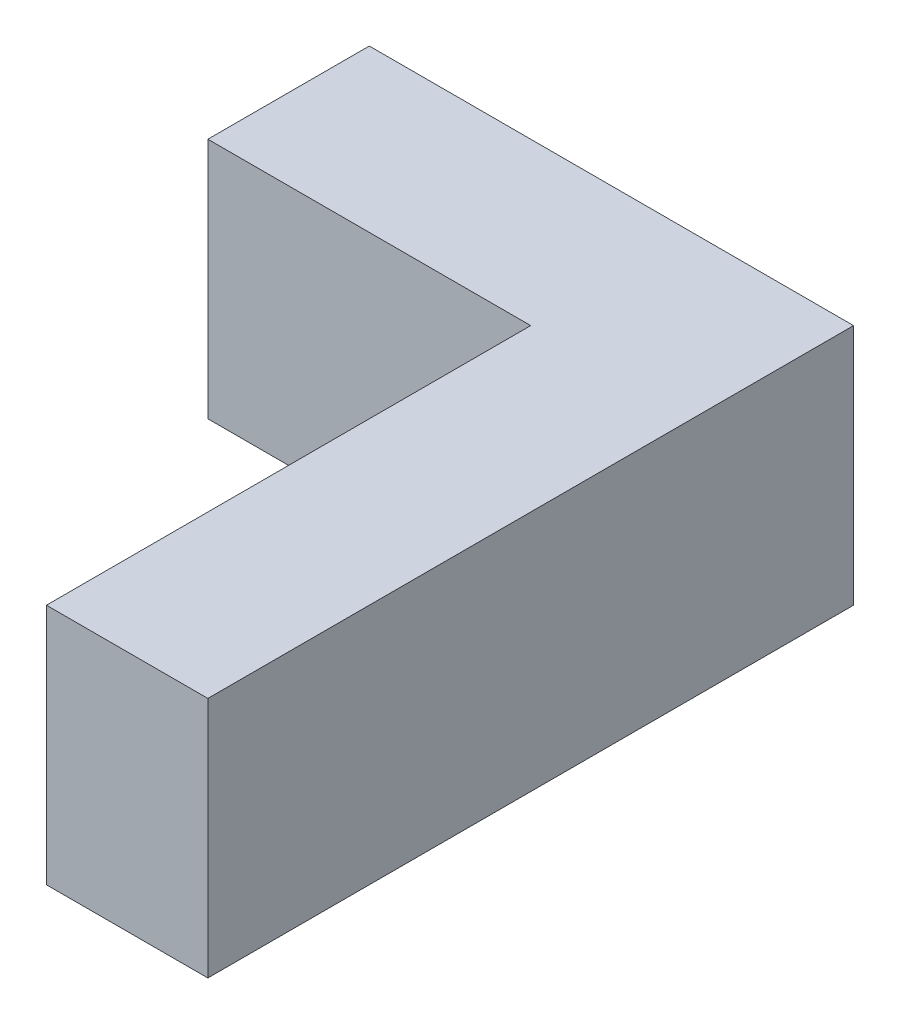
ISO-10303-21;
HEADER;
FILE_DESCRIPTION(('STEP AP214'),'2;1');
FILE_NAME('part.step','',(''),(''),'','','');
FILE_SCHEMA(('AUTOMOTIVE_DESIGN { 1 0 10303 214 1 1 1 1 }'));
ENDSEC;
DATA;
#1=APPLICATION_CONTEXT('core data for automotive mechanical design processes');
#2=APPLICATION_PROTOCOL_DEFINITION('international standard','automotive_design',2000,#1);
#3=PRODUCT_CONTEXT('',#1,'mechanical');
#4=PRODUCT('Part','Part','',(#3));
#5=PRODUCT_RELATED_PRODUCT_CATEGORY('part','',(#4));
#6=PRODUCT_DEFINITION_FORMATION('','',#4);
#7=PRODUCT_DEFINITION_CONTEXT('part definition',#1,'design');
#8=PRODUCT_DEFINITION('design','',#6,#7);
#9=PRODUCT_DEFINITION_SHAPE('','',#8);
#10=(LENGTH_UNIT() NAMED_UNIT(*) SI_UNIT(.MILLI.,.METRE.));
#11=(NAMED_UNIT(*) PLANE_ANGLE_UNIT() SI_UNIT($,.RADIAN.));
#12=(NAMED_UNIT(*) SI_UNIT($,.STERADIAN.) SOLID_ANGLE_UNIT());
#13=UNCERTAINTY_MEASURE_WITH_UNIT(LENGTH_MEASURE(1.E-05),#10,'distance_accuracy_value','');
#14=(GEOMETRIC_REPRESENTATION_CONTEXT(3) GLOBAL_UNCERTAINTY_ASSIGNED_CONTEXT((#13)) GLOBAL_UNIT_ASSIGNED_CONTEXT((#10,
#11,#12)) REPRESENTATION_CONTEXT('',''));
#15=CARTESIAN_POINT('',(0.,0.,0.));
#16=DIRECTION('',(0.,0.,1.));
#17=DIRECTION('',(1.,0.,0.));
#18=AXIS2_PLACEMENT_3D('',#15,#16,#17);
#19=CARTESIAN_POINT('',(-15.,15.,20.));
#20=DIRECTION('',(1.,0.,0.));
#21=DIRECTION('',(0.,0.,-1.));
#22=AXIS2_PLACEMENT_3D('',#19,#20,#21);
#23=PLANE('',#22);
#24=DIRECTION('',(0.,0.,1.));
#25=VECTOR('',#24,1.);
#26=CARTESIAN_POINT('',(-15.,0.,20.));
#27=LINE('',#26,#25);
#28=CARTESIAN_POINT('',(-15.,0.,-20.));
#29=VERTEX_POINT('',#28);
#30=CARTESIAN_POINT('',(-15.,0.,-9.99999999999999));
#31=VERTEX_POINT('',#30);
#32=EDGE_CURVE('E106',#29,#31,#27,.T.);
#33=ORIENTED_EDGE('',*,*,#32,.T.);
#34=DIRECTION('',(0.,1.,0.));
#35=VECTOR('',#34,1.);
#36=CARTESIAN_POINT('',(-15.,-0.000999999999999265,-9.99999999999999));
#37=LINE('',#36,#35);
#38=CARTESIAN_POINT('',(-15.,15.,-9.99999999999999));
#39=VERTEX_POINT('',#38);
#40=EDGE_CURVE('E96',#31,#39,#37,.T.);
#41=ORIENTED_EDGE('',*,*,#40,.T.);
#42=DIRECTION('',(0.,0.,1.));
#43=VECTOR('',#42,1.);
#44=CARTESIAN_POINT('',(-15.,15.,20.));
#45=LINE('',#44,#43);
#46=CARTESIAN_POINT('',(-15.,15.,-20.));
#47=VERTEX_POINT('',#46);
#48=EDGE_CURVE('E125',#47,#39,#45,.T.);
#49=ORIENTED_EDGE('',*,*,#48,.F.);
#50=DIRECTION('',(0.,-1.,0.));
#51=VECTOR('',#50,1.);
#52=CARTESIAN_POINT('',(-15.,15.,-20.));
#53=LINE('',#52,#51);
#54=EDGE_CURVE('E115',#47,#29,#53,.T.);
#55=ORIENTED_EDGE('',*,*,#54,.T.);
#56=EDGE_LOOP('',(#33,#41,#49,#55));
#57=FACE_BOUND('',#56,.T.);
#58=ADVANCED_FACE('F35',(#57),#23,.F.);
#59=CARTESIAN_POINT('',(-15.,15.,20.));
#60=DIRECTION('',(0.,0.,-1.));
#61=DIRECTION('',(-1.,0.,0.));
#62=AXIS2_PLACEMENT_3D('',#59,#60,#61);
#63=PLANE('',#62);
#64=DIRECTION('',(1.,0.,0.));
#65=VECTOR('',#64,1.);
#66=CARTESIAN_POINT('',(-15.,15.,20.));
#67=LINE('',#66,#65);
#68=CARTESIAN_POINT('',(4.99999999999999,15.,20.));
#69=VERTEX_POINT('',#68);
#70=CARTESIAN_POINT('',(15.,15.,20.));
#71=VERTEX_POINT('',#70);
#72=EDGE_CURVE('E80',#69,#71,#67,.T.);
#73=ORIENTED_EDGE('',*,*,#72,.F.);
#74=DIRECTION('',(0.,1.,0.));
#75=VECTOR('',#74,1.);
#76=CARTESIAN_POINT('',(4.99999999999999,-0.000999999999999265,20.));
#77=LINE('',#76,#75);
#78=CARTESIAN_POINT('',(4.99999999999999,0.,20.));
#79=VERTEX_POINT('',#78);
#80=EDGE_CURVE('E136',#79,#69,#77,.T.);
#81=ORIENTED_EDGE('',*,*,#80,.F.);
#82=DIRECTION('',(1.,0.,0.));
#83=VECTOR('',#82,1.);
#84=CARTESIAN_POINT('',(-15.,0.,20.));
#85=LINE('',#84,#83);
#86=CARTESIAN_POINT('',(15.,0.,20.));
#87=VERTEX_POINT('',#86);
#88=EDGE_CURVE('E116',#79,#87,#85,.T.);
#89=ORIENTED_EDGE('',*,*,#88,.T.);
#90=DIRECTION('',(0.,-1.,0.));
#91=VECTOR('',#90,1.);
#92=CARTESIAN_POINT('',(15.,15.,20.));
#93=LINE('',#92,#91);
#94=EDGE_CURVE('E11',#71,#87,#93,.T.);
#95=ORIENTED_EDGE('',*,*,#94,.F.);
#96=EDGE_LOOP('',(#73,#81,#89,#95));
#97=FACE_BOUND('',#96,.T.);
#98=ADVANCED_FACE('F134',(#97),#63,.F.);
#99=CARTESIAN_POINT('',(15.,15.,20.));
#100=DIRECTION('',(-1.,0.,0.));
#101=DIRECTION('',(0.,0.,1.));
#102=AXIS2_PLACEMENT_3D('',#99,#100,#101);
#103=PLANE('',#102);
#104=DIRECTION('',(0.,0.,-1.));
#105=VECTOR('',#104,1.);
#106=CARTESIAN_POINT('',(15.,0.,20.));
#107=LINE('',#106,#105);
#108=CARTESIAN_POINT('',(15.,0.,-20.));
#109=VERTEX_POINT('',#108);
#110=EDGE_CURVE('E118',#87,#109,#107,.T.);
#111=ORIENTED_EDGE('',*,*,#110,.T.);
#112=DIRECTION('',(0.,-1.,0.));
#113=VECTOR('',#112,1.);
#114=CARTESIAN_POINT('',(15.,15.,-20.));
#115=LINE('',#114,#113);
#116=CARTESIAN_POINT('',(15.,15.,-20.));
#117=VERTEX_POINT('',#116);
#118=EDGE_CURVE('E42',#117,#109,#115,.T.);
#119=ORIENTED_EDGE('',*,*,#118,.F.);
#120=DIRECTION('',(0.,0.,-1.));
#121=VECTOR('',#120,1.);
#122=CARTESIAN_POINT('',(15.,15.,20.));
#123=LINE('',#122,#121);
#124=EDGE_CURVE('E132',#71,#117,#123,.T.);
#125=ORIENTED_EDGE('',*,*,#124,.F.);
#126=ORIENTED_EDGE('',*,*,#94,.T.);
#127=EDGE_LOOP('',(#111,#119,#125,#126));
#128=FACE_BOUND('',#127,.T.);
#129=ADVANCED_FACE('F131',(#128),#103,.F.);
#130=CARTESIAN_POINT('',(-15.,15.,-20.));
#131=DIRECTION('',(0.,0.,1.));
#132=DIRECTION('',(1.,0.,0.));
#133=AXIS2_PLACEMENT_3D('',#130,#131,#132);
#134=PLANE('',#133);
#135=DIRECTION('',(-1.,0.,0.));
#136=VECTOR('',#135,1.);
#137=CARTESIAN_POINT('',(-15.,0.,-20.));
#138=LINE('',#137,#136);
#139=EDGE_CURVE('E75',#109,#29,#138,.T.);
#140=ORIENTED_EDGE('',*,*,#139,.T.);
#141=ORIENTED_EDGE('',*,*,#54,.F.);
#142=DIRECTION('',(-1.,0.,0.));
#143=VECTOR('',#142,1.);
#144=CARTESIAN_POINT('',(-15.,15.,-20.));
#145=LINE('',#144,#143);
#146=EDGE_CURVE('E58',#117,#47,#145,.T.);
#147=ORIENTED_EDGE('',*,*,#146,.F.);
#148=ORIENTED_EDGE('',*,*,#118,.T.);
#149=EDGE_LOOP('',(#140,#141,#147,#148));
#150=FACE_BOUND('',#149,.T.);
#151=ADVANCED_FACE('F127',(#150),#134,.F.);
#152=CARTESIAN_POINT('',(0.,15.,0.));
#153=DIRECTION('',(0.,-1.,0.));
#154=DIRECTION('',(0.,0.,-1.));
#155=AXIS2_PLACEMENT_3D('',#152,#153,#154);
#156=PLANE('',#155);
#157=ORIENTED_EDGE('',*,*,#48,.T.);
#158=DIRECTION('',(-1.,0.,0.));
#159=VECTOR('',#158,1.);
#160=CARTESIAN_POINT('',(-15.,15.,-9.99999999999999));
#161=LINE('',#160,#159);
#162=CARTESIAN_POINT('',(4.99999999999999,15.,-10.));
#163=VERTEX_POINT('',#162);
#164=EDGE_CURVE('E102',#163,#39,#161,.T.);
#165=ORIENTED_EDGE('',*,*,#164,.F.);
#166=DIRECTION('',(0.,0.,-1.));
#167=VECTOR('',#166,1.);
#168=CARTESIAN_POINT('',(4.99999999999999,15.,20.));
#169=LINE('',#168,#167);
#170=EDGE_CURVE('E113',#69,#163,#169,.T.);
#171=ORIENTED_EDGE('',*,*,#170,.F.);
#172=ORIENTED_EDGE('',*,*,#72,.T.);
#173=ORIENTED_EDGE('',*,*,#124,.T.);
#174=ORIENTED_EDGE('',*,*,#146,.T.);
#175=EDGE_LOOP('',(#157,#165,#171,#172,#173,#174));
#176=FACE_BOUND('',#175,.T.);
#177=ADVANCED_FACE('F142',(#176),#156,.F.);
#178=CARTESIAN_POINT('',(0.,0.,0.));
#179=DIRECTION('',(0.,-1.,0.));
#180=DIRECTION('',(0.,0.,-1.));
#181=AXIS2_PLACEMENT_3D('',#178,#179,#180);
#182=PLANE('',#181);
#183=DIRECTION('',(-1.,0.,0.));
#184=VECTOR('',#183,1.);
#185=CARTESIAN_POINT('',(-15.,0.,-9.99999999999999));
#186=LINE('',#185,#184);
#187=CARTESIAN_POINT('',(4.99999999999999,0.,-10.));
#188=VERTEX_POINT('',#187);
#189=EDGE_CURVE('E99',#188,#31,#186,.T.);
#190=ORIENTED_EDGE('',*,*,#189,.T.);
#191=ORIENTED_EDGE('',*,*,#32,.F.);
#192=ORIENTED_EDGE('',*,*,#139,.F.);
#193=ORIENTED_EDGE('',*,*,#110,.F.);
#194=ORIENTED_EDGE('',*,*,#88,.F.);
#195=DIRECTION('',(0.,0.,-1.));
#196=VECTOR('',#195,1.);
#197=CARTESIAN_POINT('',(4.99999999999999,0.,20.));
#198=LINE('',#197,#196);
#199=EDGE_CURVE('E112',#79,#188,#198,.T.);
#200=ORIENTED_EDGE('',*,*,#199,.T.);
#201=EDGE_LOOP('',(#190,#191,#192,#193,#194,#200));
#202=FACE_BOUND('',#201,.T.);
#203=ADVANCED_FACE('F110',(#202),#182,.T.);
#204=CARTESIAN_POINT('',(-15.,-0.000999999999999265,-9.99999999999999));
#205=DIRECTION('',(0.,0.,-1.));
#206=DIRECTION('',(-1.,0.,0.));
#207=AXIS2_PLACEMENT_3D('',#204,#205,#206);
#208=PLANE('',#207);
#209=DIRECTION('',(0.,1.,0.));
#210=VECTOR('',#209,1.);
#211=CARTESIAN_POINT('',(4.99999999999999,-0.000999999999999265,-10.));
#212=LINE('',#211,#210);
#213=EDGE_CURVE('E49',#188,#163,#212,.T.);
#214=ORIENTED_EDGE('',*,*,#213,.T.);
#215=ORIENTED_EDGE('',*,*,#164,.T.);
#216=ORIENTED_EDGE('',*,*,#40,.F.);
#217=ORIENTED_EDGE('',*,*,#189,.F.);
#218=EDGE_LOOP('',(#214,#215,#216,#217));
#219=FACE_BOUND('',#218,.T.);
#220=ADVANCED_FACE('F98',(#219),#208,.F.);
#221=CARTESIAN_POINT('',(4.99999999999999,-0.000999999999999265,20.));
#222=DIRECTION('',(1.,0.,0.));
#223=DIRECTION('',(0.,0.,-1.));
#224=AXIS2_PLACEMENT_3D('',#221,#222,#223);
#225=PLANE('',#224);
#226=ORIENTED_EDGE('',*,*,#80,.T.);
#227=ORIENTED_EDGE('',*,*,#170,.T.);
#228=ORIENTED_EDGE('',*,*,#213,.F.);
#229=ORIENTED_EDGE('',*,*,#199,.F.);
#230=EDGE_LOOP('',(#226,#227,#228,#229));
#231=FACE_BOUND('',#230,.T.);
#232=ADVANCED_FACE('F193',(#231),#225,.F.);
#233=CLOSED_SHELL('',(#58,#98,#129,#151,#177,#203,#220,#232));
#234=MANIFOLD_SOLID_BREP('B2',#233);
#235=ADVANCED_BREP_SHAPE_REPRESENTATION('',(#18,#234),#14);
#236=SHAPE_DEFINITION_REPRESENTATION(#9,#235);
ENDSEC;
END-ISO-10303-21;
